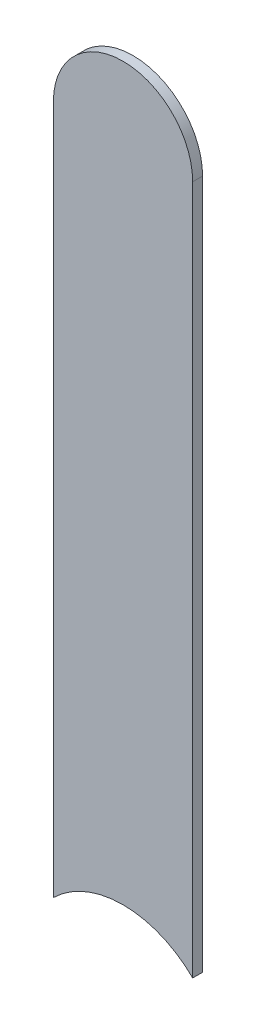
ISO-10303-21;
HEADER;
FILE_DESCRIPTION(('STEP AP214'),'2;1');
FILE_NAME('part.step','',(''),(''),'','','');
FILE_SCHEMA(('AUTOMOTIVE_DESIGN { 1 0 10303 214 1 1 1 1 }'));
ENDSEC;
DATA;
#1=APPLICATION_CONTEXT('core data for automotive mechanical design processes');
#2=APPLICATION_PROTOCOL_DEFINITION('international standard','automotive_design',2000,#1);
#3=PRODUCT_CONTEXT('',#1,'mechanical');
#4=PRODUCT('Part','Part','',(#3));
#5=PRODUCT_RELATED_PRODUCT_CATEGORY('part','',(#4));
#6=PRODUCT_DEFINITION_FORMATION('','',#4);
#7=PRODUCT_DEFINITION_CONTEXT('part definition',#1,'design');
#8=PRODUCT_DEFINITION('design','',#6,#7);
#9=PRODUCT_DEFINITION_SHAPE('','',#8);
#10=(LENGTH_UNIT() NAMED_UNIT(*) SI_UNIT(.MILLI.,.METRE.));
#11=(NAMED_UNIT(*) PLANE_ANGLE_UNIT() SI_UNIT($,.RADIAN.));
#12=(NAMED_UNIT(*) SI_UNIT($,.STERADIAN.) SOLID_ANGLE_UNIT());
#13=UNCERTAINTY_MEASURE_WITH_UNIT(LENGTH_MEASURE(1.E-05),#10,'distance_accuracy_value','');
#14=(GEOMETRIC_REPRESENTATION_CONTEXT(3) GLOBAL_UNCERTAINTY_ASSIGNED_CONTEXT((#13)) GLOBAL_UNIT_ASSIGNED_CONTEXT((#10,
#11,#12)) REPRESENTATION_CONTEXT('',''));
#15=CARTESIAN_POINT('',(0.,0.,0.));
#16=DIRECTION('',(0.,0.,1.));
#17=DIRECTION('',(1.,0.,0.));
#18=AXIS2_PLACEMENT_3D('',#15,#16,#17);
#19=CARTESIAN_POINT('',(55.91287014,69.8277334355931,0.));
#20=DIRECTION('',(-1.,0.,0.));
#21=DIRECTION('',(0.,1.,0.));
#22=AXIS2_PLACEMENT_3D('',#19,#20,#21);
#23=PLANE('',#22);
#24=DIRECTION('',(0.,1.,0.));
#25=VECTOR('',#24,1.);
#26=CARTESIAN_POINT('',(55.91287014,69.57484688,0.03556));
#27=LINE('',#26,#25);
#28=CARTESIAN_POINT('',(55.91287014,69.8277334355931,0.03556));
#29=VERTEX_POINT('',#28);
#30=CARTESIAN_POINT('',(55.91287014,72.30344442,0.03556));
#31=VERTEX_POINT('',#30);
#32=EDGE_CURVE('E11',#29,#31,#27,.T.);
#33=ORIENTED_EDGE('',*,*,#32,.F.);
#34=DIRECTION('',(0.,0.,1.));
#35=VECTOR('',#34,1.);
#36=CARTESIAN_POINT('',(55.91287014,69.8277334355931,0.));
#37=LINE('',#36,#35);
#38=CARTESIAN_POINT('',(55.91287014,69.8277334355931,0.));
#39=VERTEX_POINT('',#38);
#40=EDGE_CURVE('E24',#39,#29,#37,.T.);
#41=ORIENTED_EDGE('',*,*,#40,.F.);
#42=DIRECTION('',(0.,1.,0.));
#43=VECTOR('',#42,1.);
#44=CARTESIAN_POINT('',(55.91287014,69.57484688,0.));
#45=LINE('',#44,#43);
#46=CARTESIAN_POINT('',(55.91287014,72.30344442,0.));
#47=VERTEX_POINT('',#46);
#48=EDGE_CURVE('E75',#39,#47,#45,.T.);
#49=ORIENTED_EDGE('',*,*,#48,.T.);
#50=DIRECTION('',(0.,0.,1.));
#51=VECTOR('',#50,1.);
#52=CARTESIAN_POINT('',(55.91287014,72.30344442,0.));
#53=LINE('',#52,#51);
#54=EDGE_CURVE('E37',#47,#31,#53,.T.);
#55=ORIENTED_EDGE('',*,*,#54,.T.);
#56=EDGE_LOOP('',(#33,#41,#49,#55));
#57=FACE_BOUND('',#56,.T.);
#58=ADVANCED_FACE('F17',(#57),#23,.F.);
#59=CARTESIAN_POINT('',(55.66287064,72.30344442,0.));
#60=DIRECTION('',(0.,0.,-1.));
#61=DIRECTION('',(1.,0.,0.));
#62=AXIS2_PLACEMENT_3D('',#59,#60,#61);
#63=CYLINDRICAL_SURFACE('',#62,0.249999500000001);
#64=CARTESIAN_POINT('',(55.66287064,72.30344442,0.03556));
#65=DIRECTION('',(0.,0.,1.));
#66=DIRECTION('',(1.,0.,0.));
#67=AXIS2_PLACEMENT_3D('',#64,#65,#66);
#68=CIRCLE('',#67,0.249999500000001);
#69=CARTESIAN_POINT('',(55.41287114,72.30344442,0.03556));
#70=VERTEX_POINT('',#69);
#71=EDGE_CURVE('E83',#31,#70,#68,.T.);
#72=ORIENTED_EDGE('',*,*,#71,.F.);
#73=ORIENTED_EDGE('',*,*,#54,.F.);
#74=CARTESIAN_POINT('',(55.66287064,72.30344442,0.));
#75=DIRECTION('',(0.,0.,1.));
#76=DIRECTION('',(1.,0.,0.));
#77=AXIS2_PLACEMENT_3D('',#74,#75,#76);
#78=CIRCLE('',#77,0.249999500000001);
#79=CARTESIAN_POINT('',(55.41287114,72.30344442,0.));
#80=VERTEX_POINT('',#79);
#81=EDGE_CURVE('E81',#47,#80,#78,.T.);
#82=ORIENTED_EDGE('',*,*,#81,.T.);
#83=DIRECTION('',(0.,0.,1.));
#84=VECTOR('',#83,1.);
#85=CARTESIAN_POINT('',(55.41287114,72.30344442,0.));
#86=LINE('',#85,#84);
#87=EDGE_CURVE('E67',#80,#70,#86,.T.);
#88=ORIENTED_EDGE('',*,*,#87,.T.);
#89=EDGE_LOOP('',(#72,#73,#82,#88));
#90=FACE_BOUND('',#89,.T.);
#91=ADVANCED_FACE('F89',(#90),#63,.T.);
#92=CARTESIAN_POINT('',(55.41287114,72.30344442,0.));
#93=DIRECTION('',(1.,0.,0.));
#94=DIRECTION('',(0.,-1.,0.));
#95=AXIS2_PLACEMENT_3D('',#92,#93,#94);
#96=PLANE('',#95);
#97=DIRECTION('',(0.,-1.,0.));
#98=VECTOR('',#97,1.);
#99=CARTESIAN_POINT('',(55.41287114,72.30344442,0.03556));
#100=LINE('',#99,#98);
#101=CARTESIAN_POINT('',(55.41287114,69.8277334355931,0.03556));
#102=VERTEX_POINT('',#101);
#103=EDGE_CURVE('E71',#70,#102,#100,.T.);
#104=ORIENTED_EDGE('',*,*,#103,.F.);
#105=ORIENTED_EDGE('',*,*,#87,.F.);
#106=DIRECTION('',(0.,-1.,0.));
#107=VECTOR('',#106,1.);
#108=CARTESIAN_POINT('',(55.41287114,72.30344442,0.));
#109=LINE('',#108,#107);
#110=CARTESIAN_POINT('',(55.41287114,69.8277334355931,0.));
#111=VERTEX_POINT('',#110);
#112=EDGE_CURVE('E63',#80,#111,#109,.T.);
#113=ORIENTED_EDGE('',*,*,#112,.T.);
#114=DIRECTION('',(0.,0.,1.));
#115=VECTOR('',#114,1.);
#116=CARTESIAN_POINT('',(55.41287114,69.8277334355931,0.));
#117=LINE('',#116,#115);
#118=EDGE_CURVE('E53',#111,#102,#117,.T.);
#119=ORIENTED_EDGE('',*,*,#118,.T.);
#120=EDGE_LOOP('',(#104,#105,#113,#119));
#121=FACE_BOUND('',#120,.T.);
#122=ADVANCED_FACE('F66',(#121),#96,.F.);
#123=CARTESIAN_POINT('',(55.66287064,69.57484688,0.));
#124=DIRECTION('',(0.,0.,-1.));
#125=DIRECTION('',(1.,0.,0.));
#126=AXIS2_PLACEMENT_3D('',#123,#124,#125);
#127=CYLINDRICAL_SURFACE('',#126,0.3556);
#128=ORIENTED_EDGE('',*,*,#40,.T.);
#129=CARTESIAN_POINT('',(55.66287064,69.57484688,0.03556));
#130=DIRECTION('',(0.,0.,1.));
#131=DIRECTION('',(1.,0.,0.));
#132=AXIS2_PLACEMENT_3D('',#129,#130,#131);
#133=CIRCLE('',#132,0.3556);
#134=EDGE_CURVE('E59',#29,#102,#133,.T.);
#135=ORIENTED_EDGE('',*,*,#134,.T.);
#136=ORIENTED_EDGE('',*,*,#118,.F.);
#137=CARTESIAN_POINT('',(55.66287064,69.57484688,0.));
#138=DIRECTION('',(0.,0.,1.));
#139=DIRECTION('',(1.,0.,0.));
#140=AXIS2_PLACEMENT_3D('',#137,#138,#139);
#141=CIRCLE('',#140,0.3556);
#142=EDGE_CURVE('E57',#39,#111,#141,.T.);
#143=ORIENTED_EDGE('',*,*,#142,.F.);
#144=EDGE_LOOP('',(#128,#135,#136,#143));
#145=FACE_BOUND('',#144,.T.);
#146=ADVANCED_FACE('F55',(#145),#127,.F.);
#147=CARTESIAN_POINT('',(55.91287014,69.57484688,0.));
#148=DIRECTION('',(0.,0.,-1.));
#149=DIRECTION('',(-1.,0.,0.));
#150=AXIS2_PLACEMENT_3D('',#147,#148,#149);
#151=PLANE('',#150);
#152=ORIENTED_EDGE('',*,*,#48,.F.);
#153=ORIENTED_EDGE('',*,*,#142,.T.);
#154=ORIENTED_EDGE('',*,*,#112,.F.);
#155=ORIENTED_EDGE('',*,*,#81,.F.);
#156=EDGE_LOOP('',(#152,#153,#154,#155));
#157=FACE_BOUND('',#156,.T.);
#158=ADVANCED_FACE('F74',(#157),#151,.T.);
#159=CARTESIAN_POINT('',(55.91287014,69.57484688,0.03556));
#160=DIRECTION('',(0.,0.,-1.));
#161=DIRECTION('',(-1.,0.,0.));
#162=AXIS2_PLACEMENT_3D('',#159,#160,#161);
#163=PLANE('',#162);
#164=ORIENTED_EDGE('',*,*,#134,.F.);
#165=ORIENTED_EDGE('',*,*,#32,.T.);
#166=ORIENTED_EDGE('',*,*,#71,.T.);
#167=ORIENTED_EDGE('',*,*,#103,.T.);
#168=EDGE_LOOP('',(#164,#165,#166,#167));
#169=FACE_BOUND('',#168,.T.);
#170=ADVANCED_FACE('F91',(#169),#163,.F.);
#171=CLOSED_SHELL('',(#58,#91,#122,#146,#158,#170));
#172=MANIFOLD_SOLID_BREP('B1',#171);
#173=ADVANCED_BREP_SHAPE_REPRESENTATION('',(#18,#172),#14);
#174=SHAPE_DEFINITION_REPRESENTATION(#9,#173);
ENDSEC;
END-ISO-10303-21;
